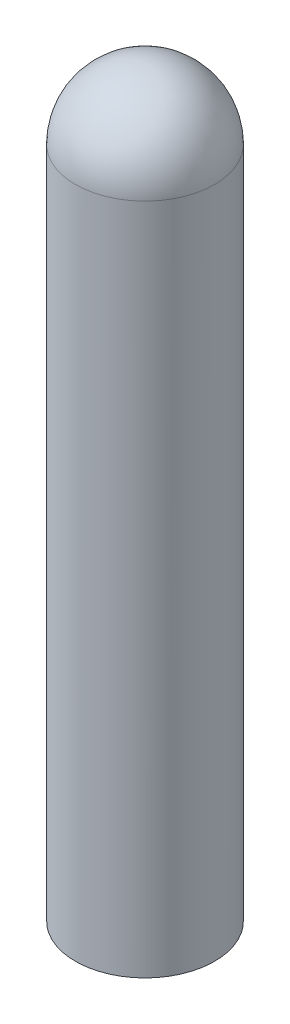
ISO-10303-21;
HEADER;
FILE_DESCRIPTION(('STEP AP214'),'2;1');
FILE_NAME('part.step','',(''),(''),'','','');
FILE_SCHEMA(('AUTOMOTIVE_DESIGN { 1 0 10303 214 1 1 1 1 }'));
ENDSEC;
DATA;
#1=APPLICATION_CONTEXT('core data for automotive mechanical design processes');
#2=APPLICATION_PROTOCOL_DEFINITION('international standard','automotive_design',2000,#1);
#3=PRODUCT_CONTEXT('',#1,'mechanical');
#4=PRODUCT('Part','Part','',(#3));
#5=PRODUCT_RELATED_PRODUCT_CATEGORY('part','',(#4));
#6=PRODUCT_DEFINITION_FORMATION('','',#4);
#7=PRODUCT_DEFINITION_CONTEXT('part definition',#1,'design');
#8=PRODUCT_DEFINITION('design','',#6,#7);
#9=PRODUCT_DEFINITION_SHAPE('','',#8);
#10=(LENGTH_UNIT() NAMED_UNIT(*) SI_UNIT(.MILLI.,.METRE.));
#11=(NAMED_UNIT(*) PLANE_ANGLE_UNIT() SI_UNIT($,.RADIAN.));
#12=(NAMED_UNIT(*) SI_UNIT($,.STERADIAN.) SOLID_ANGLE_UNIT());
#13=UNCERTAINTY_MEASURE_WITH_UNIT(LENGTH_MEASURE(1.E-05),#10,'distance_accuracy_value','');
#14=(GEOMETRIC_REPRESENTATION_CONTEXT(3) GLOBAL_UNCERTAINTY_ASSIGNED_CONTEXT((#13)) GLOBAL_UNIT_ASSIGNED_CONTEXT((#10,
#11,#12)) REPRESENTATION_CONTEXT('',''));
#15=CARTESIAN_POINT('',(0.,0.,0.));
#16=DIRECTION('',(0.,0.,1.));
#17=DIRECTION('',(1.,0.,0.));
#18=AXIS2_PLACEMENT_3D('',#15,#16,#17);
#19=CARTESIAN_POINT('',(0.,0.,0.));
#20=DIRECTION('',(0.,-1.,0.));
#21=DIRECTION('',(-1.,0.,0.));
#22=AXIS2_PLACEMENT_3D('',#19,#20,#21);
#23=SPHERICAL_SURFACE('',#22,10.);
#24=CARTESIAN_POINT('',(0.,-8.66025403784439,0.));
#25=DIRECTION('',(0.,-1.,0.));
#26=DIRECTION('',(0.,0.,-1.));
#27=AXIS2_PLACEMENT_3D('',#24,#25,#26);
#28=CIRCLE('',#27,5.);
#29=CARTESIAN_POINT('',(0.,-8.66025403784439,-5.));
#30=VERTEX_POINT('',#29);
#31=EDGE_CURVE('E10',#30,#30,#28,.T.);
#32=ORIENTED_EDGE('',*,*,#31,.T.);
#33=EDGE_LOOP('',(#32));
#34=FACE_BOUND('',#33,.T.);
#35=ADVANCED_FACE('F38',(#34),#23,.T.);
#36=CARTESIAN_POINT('',(0.,-10.,0.));
#37=DIRECTION('',(0.,-1.,0.));
#38=DIRECTION('',(0.,0.,-1.));
#39=AXIS2_PLACEMENT_3D('',#36,#37,#38);
#40=CYLINDRICAL_SURFACE('',#39,5.);
#41=CARTESIAN_POINT('',(0.,39.6602540378444,0.));
#42=DIRECTION('',(0.,1.,0.));
#43=DIRECTION('',(0.,0.,1.));
#44=AXIS2_PLACEMENT_3D('',#41,#42,#43);
#45=CIRCLE('',#44,5.);
#46=CARTESIAN_POINT('',(0.,39.6602540378444,5.));
#47=VERTEX_POINT('',#46);
#48=EDGE_CURVE('E44',#47,#47,#45,.T.);
#49=ORIENTED_EDGE('',*,*,#48,.F.);
#50=EDGE_LOOP('',(#49));
#51=FACE_BOUND('',#50,.T.);
#52=ORIENTED_EDGE('',*,*,#31,.F.);
#53=EDGE_LOOP('',(#52));
#54=FACE_BOUND('',#53,.T.);
#55=ADVANCED_FACE('F52',(#51,#54),#40,.T.);
#56=CARTESIAN_POINT('',(0.,39.6602540378444,0.));
#57=DIRECTION('',(0.,-1.,0.));
#58=DIRECTION('',(1.,0.,0.));
#59=AXIS2_PLACEMENT_3D('',#56,#57,#58);
#60=SPHERICAL_SURFACE('',#59,5.);
#61=ORIENTED_EDGE('',*,*,#48,.T.);
#62=EDGE_LOOP('',(#61));
#63=FACE_BOUND('',#62,.T.);
#64=ADVANCED_FACE('F50',(#63),#60,.T.);
#65=CLOSED_SHELL('',(#35,#55,#64));
#66=MANIFOLD_SOLID_BREP('B2',#65);
#67=ADVANCED_BREP_SHAPE_REPRESENTATION('',(#18,#66),#14);
#68=SHAPE_DEFINITION_REPRESENTATION(#9,#67);
ENDSEC;
END-ISO-10303-21;
